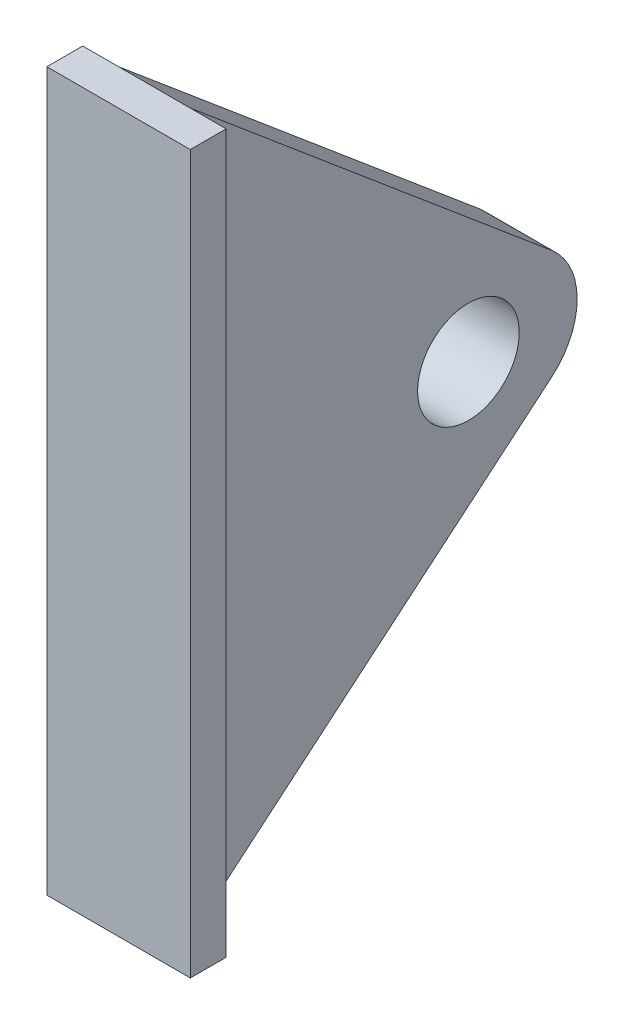
ISO-10303-21;
HEADER;
FILE_DESCRIPTION(('STEP AP214'),'2;1');
FILE_NAME('part.step','',(''),(''),'','','');
FILE_SCHEMA(('AUTOMOTIVE_DESIGN { 1 0 10303 214 1 1 1 1 }'));
ENDSEC;
DATA;
#1=APPLICATION_CONTEXT('core data for automotive mechanical design processes');
#2=APPLICATION_PROTOCOL_DEFINITION('international standard','automotive_design',2000,#1);
#3=PRODUCT_CONTEXT('',#1,'mechanical');
#4=PRODUCT('Part','Part','',(#3));
#5=PRODUCT_RELATED_PRODUCT_CATEGORY('part','',(#4));
#6=PRODUCT_DEFINITION_FORMATION('','',#4);
#7=PRODUCT_DEFINITION_CONTEXT('part definition',#1,'design');
#8=PRODUCT_DEFINITION('design','',#6,#7);
#9=PRODUCT_DEFINITION_SHAPE('','',#8);
#10=(LENGTH_UNIT() NAMED_UNIT(*) SI_UNIT(.MILLI.,.METRE.));
#11=(NAMED_UNIT(*) PLANE_ANGLE_UNIT() SI_UNIT($,.RADIAN.));
#12=(NAMED_UNIT(*) SI_UNIT($,.STERADIAN.) SOLID_ANGLE_UNIT());
#13=UNCERTAINTY_MEASURE_WITH_UNIT(LENGTH_MEASURE(1.E-05),#10,'distance_accuracy_value','');
#14=(GEOMETRIC_REPRESENTATION_CONTEXT(3) GLOBAL_UNCERTAINTY_ASSIGNED_CONTEXT((#13)) GLOBAL_UNIT_ASSIGNED_CONTEXT((#10,
#11,#12)) REPRESENTATION_CONTEXT('',''));
#15=CARTESIAN_POINT('',(0.,0.,0.));
#16=DIRECTION('',(0.,0.,1.));
#17=DIRECTION('',(1.,0.,0.));
#18=AXIS2_PLACEMENT_3D('',#15,#16,#17);
#19=CARTESIAN_POINT('',(-5.99999999999999,-30.,0.));
#20=DIRECTION('',(0.,0.,-1.));
#21=DIRECTION('',(-1.,0.,0.));
#22=AXIS2_PLACEMENT_3D('',#19,#20,#21);
#23=PLANE('',#22);
#24=DIRECTION('',(-1.,0.,0.));
#25=VECTOR('',#24,1.);
#26=CARTESIAN_POINT('',(6.,30.,0.));
#27=LINE('',#26,#25);
#28=CARTESIAN_POINT('',(-3.,30.,0.));
#29=VERTEX_POINT('',#28);
#30=CARTESIAN_POINT('',(-6.,30.,0.));
#31=VERTEX_POINT('',#30);
#32=EDGE_CURVE('E184',#29,#31,#27,.T.);
#33=ORIENTED_EDGE('',*,*,#32,.F.);
#34=DIRECTION('',(0.,-1.,0.));
#35=VECTOR('',#34,1.);
#36=CARTESIAN_POINT('',(-3.,-30.,0.));
#37=LINE('',#36,#35);
#38=CARTESIAN_POINT('',(-3.,-30.,0.));
#39=VERTEX_POINT('',#38);
#40=EDGE_CURVE('E154',#29,#39,#37,.T.);
#41=ORIENTED_EDGE('',*,*,#40,.T.);
#42=DIRECTION('',(1.,0.,0.));
#43=VECTOR('',#42,1.);
#44=CARTESIAN_POINT('',(6.00000000000001,-30.,0.));
#45=LINE('',#44,#43);
#46=CARTESIAN_POINT('',(-5.99999999999999,-30.,0.));
#47=VERTEX_POINT('',#46);
#48=EDGE_CURVE('E122',#47,#39,#45,.T.);
#49=ORIENTED_EDGE('',*,*,#48,.F.);
#50=DIRECTION('',(0.,-1.,0.));
#51=VECTOR('',#50,1.);
#52=CARTESIAN_POINT('',(-6.,30.,0.));
#53=LINE('',#52,#51);
#54=EDGE_CURVE('E123',#31,#47,#53,.T.);
#55=ORIENTED_EDGE('',*,*,#54,.F.);
#56=EDGE_LOOP('',(#33,#41,#49,#55));
#57=FACE_BOUND('',#56,.T.);
#58=ADVANCED_FACE('F31',(#57),#23,.T.);
#59=CARTESIAN_POINT('',(-6.,30.,3.));
#60=DIRECTION('',(1.,0.,0.));
#61=DIRECTION('',(0.,1.,0.));
#62=AXIS2_PLACEMENT_3D('',#59,#60,#61);
#63=PLANE('',#62);
#64=ORIENTED_EDGE('',*,*,#54,.T.);
#65=DIRECTION('',(0.,0.,-1.));
#66=VECTOR('',#65,1.);
#67=CARTESIAN_POINT('',(-5.99999999999999,-30.,3.));
#68=LINE('',#67,#66);
#69=CARTESIAN_POINT('',(-5.99999999999999,-30.,3.));
#70=VERTEX_POINT('',#69);
#71=EDGE_CURVE('E148',#70,#47,#68,.T.);
#72=ORIENTED_EDGE('',*,*,#71,.F.);
#73=DIRECTION('',(0.,-1.,0.));
#74=VECTOR('',#73,1.);
#75=CARTESIAN_POINT('',(-6.,30.,3.));
#76=LINE('',#75,#74);
#77=CARTESIAN_POINT('',(-6.,30.,3.));
#78=VERTEX_POINT('',#77);
#79=EDGE_CURVE('E167',#78,#70,#76,.T.);
#80=ORIENTED_EDGE('',*,*,#79,.F.);
#81=DIRECTION('',(0.,0.,-1.));
#82=VECTOR('',#81,1.);
#83=CARTESIAN_POINT('',(-6.,30.,3.));
#84=LINE('',#83,#82);
#85=EDGE_CURVE('E177',#78,#31,#84,.T.);
#86=ORIENTED_EDGE('',*,*,#85,.T.);
#87=EDGE_LOOP('',(#64,#72,#80,#86));
#88=FACE_BOUND('',#87,.T.);
#89=ADVANCED_FACE('F205',(#88),#63,.F.);
#90=CARTESIAN_POINT('',(6.00000000000001,-30.,3.));
#91=DIRECTION('',(0.,1.,0.));
#92=DIRECTION('',(0.,0.,1.));
#93=AXIS2_PLACEMENT_3D('',#90,#91,#92);
#94=PLANE('',#93);
#95=ORIENTED_EDGE('',*,*,#48,.T.);
#96=DIRECTION('',(1.,0.,0.));
#97=VECTOR('',#96,1.);
#98=CARTESIAN_POINT('',(-3.,-30.,0.));
#99=LINE('',#98,#97);
#100=CARTESIAN_POINT('',(3.,-30.,0.));
#101=VERTEX_POINT('',#100);
#102=EDGE_CURVE('E100',#39,#101,#99,.T.);
#103=ORIENTED_EDGE('',*,*,#102,.T.);
#104=CARTESIAN_POINT('',(6.00000000000001,-30.,0.));
#105=VERTEX_POINT('',#104);
#106=EDGE_CURVE('E116',#101,#105,#45,.T.);
#107=ORIENTED_EDGE('',*,*,#106,.T.);
#108=DIRECTION('',(0.,0.,-1.));
#109=VECTOR('',#108,1.);
#110=CARTESIAN_POINT('',(6.00000000000001,-30.,3.));
#111=LINE('',#110,#109);
#112=CARTESIAN_POINT('',(6.00000000000001,-30.,3.));
#113=VERTEX_POINT('',#112);
#114=EDGE_CURVE('E150',#113,#105,#111,.T.);
#115=ORIENTED_EDGE('',*,*,#114,.F.);
#116=DIRECTION('',(1.,0.,0.));
#117=VECTOR('',#116,1.);
#118=CARTESIAN_POINT('',(6.00000000000001,-30.,3.));
#119=LINE('',#118,#117);
#120=EDGE_CURVE('E170',#70,#113,#119,.T.);
#121=ORIENTED_EDGE('',*,*,#120,.F.);
#122=ORIENTED_EDGE('',*,*,#71,.T.);
#123=EDGE_LOOP('',(#95,#103,#107,#115,#121,#122));
#124=FACE_BOUND('',#123,.T.);
#125=ADVANCED_FACE('F126',(#124),#94,.F.);
#126=CARTESIAN_POINT('',(6.,30.,3.));
#127=DIRECTION('',(-1.,0.,0.));
#128=DIRECTION('',(0.,-1.,0.));
#129=AXIS2_PLACEMENT_3D('',#126,#127,#128);
#130=PLANE('',#129);
#131=DIRECTION('',(0.,1.,0.));
#132=VECTOR('',#131,1.);
#133=CARTESIAN_POINT('',(6.,30.,0.));
#134=LINE('',#133,#132);
#135=CARTESIAN_POINT('',(6.,30.,0.));
#136=VERTEX_POINT('',#135);
#137=EDGE_CURVE('E118',#105,#136,#134,.T.);
#138=ORIENTED_EDGE('',*,*,#137,.T.);
#139=DIRECTION('',(0.,0.,-1.));
#140=VECTOR('',#139,1.);
#141=CARTESIAN_POINT('',(6.,30.,3.));
#142=LINE('',#141,#140);
#143=CARTESIAN_POINT('',(6.,30.,3.));
#144=VERTEX_POINT('',#143);
#145=EDGE_CURVE('E191',#144,#136,#142,.T.);
#146=ORIENTED_EDGE('',*,*,#145,.F.);
#147=DIRECTION('',(0.,1.,0.));
#148=VECTOR('',#147,1.);
#149=CARTESIAN_POINT('',(6.,30.,3.));
#150=LINE('',#149,#148);
#151=EDGE_CURVE('E173',#113,#144,#150,.T.);
#152=ORIENTED_EDGE('',*,*,#151,.F.);
#153=ORIENTED_EDGE('',*,*,#114,.T.);
#154=EDGE_LOOP('',(#138,#146,#152,#153));
#155=FACE_BOUND('',#154,.T.);
#156=ADVANCED_FACE('F196',(#155),#130,.F.);
#157=CARTESIAN_POINT('',(6.,30.,3.));
#158=DIRECTION('',(0.,-1.,0.));
#159=DIRECTION('',(0.,0.,-1.));
#160=AXIS2_PLACEMENT_3D('',#157,#158,#159);
#161=PLANE('',#160);
#162=CARTESIAN_POINT('',(3.,30.,0.));
#163=VERTEX_POINT('',#162);
#164=EDGE_CURVE('E171',#136,#163,#27,.T.);
#165=ORIENTED_EDGE('',*,*,#164,.T.);
#166=DIRECTION('',(1.,0.,0.));
#167=VECTOR('',#166,1.);
#168=CARTESIAN_POINT('',(-3.,30.,0.));
#169=LINE('',#168,#167);
#170=EDGE_CURVE('E128',#29,#163,#169,.T.);
#171=ORIENTED_EDGE('',*,*,#170,.F.);
#172=ORIENTED_EDGE('',*,*,#32,.T.);
#173=ORIENTED_EDGE('',*,*,#85,.F.);
#174=DIRECTION('',(-1.,0.,0.));
#175=VECTOR('',#174,1.);
#176=CARTESIAN_POINT('',(6.,30.,3.));
#177=LINE('',#176,#175);
#178=EDGE_CURVE('E175',#144,#78,#177,.T.);
#179=ORIENTED_EDGE('',*,*,#178,.F.);
#180=ORIENTED_EDGE('',*,*,#145,.T.);
#181=EDGE_LOOP('',(#165,#171,#172,#173,#179,#180));
#182=FACE_BOUND('',#181,.T.);
#183=ADVANCED_FACE('F209',(#182),#161,.F.);
#184=CARTESIAN_POINT('',(-5.99999999999999,-30.,3.));
#185=DIRECTION('',(0.,0.,-1.));
#186=DIRECTION('',(-1.,0.,0.));
#187=AXIS2_PLACEMENT_3D('',#184,#185,#186);
#188=PLANE('',#187);
#189=ORIENTED_EDGE('',*,*,#79,.T.);
#190=ORIENTED_EDGE('',*,*,#120,.T.);
#191=ORIENTED_EDGE('',*,*,#151,.T.);
#192=ORIENTED_EDGE('',*,*,#178,.T.);
#193=EDGE_LOOP('',(#189,#190,#191,#192));
#194=FACE_BOUND('',#193,.T.);
#195=ADVANCED_FACE('F201',(#194),#188,.F.);
#196=DIRECTION('',(0.,-1.,0.));
#197=VECTOR('',#196,1.);
#198=CARTESIAN_POINT('',(3.,-30.,0.));
#199=LINE('',#198,#197);
#200=EDGE_CURVE('E105',#163,#101,#199,.T.);
#201=ORIENTED_EDGE('',*,*,#200,.F.);
#202=ORIENTED_EDGE('',*,*,#164,.F.);
#203=ORIENTED_EDGE('',*,*,#137,.F.);
#204=ORIENTED_EDGE('',*,*,#106,.F.);
#205=EDGE_LOOP('',(#201,#202,#203,#204));
#206=FACE_BOUND('',#205,.T.);
#207=ADVANCED_FACE('F117',(#206),#23,.T.);
#208=CARTESIAN_POINT('',(-3.,30.,0.));
#209=DIRECTION('',(0.,0.765348251507662,-0.643616387232461));
#210=DIRECTION('',(0.,0.643616387232461,0.765348251507662));
#211=AXIS2_PLACEMENT_3D('',#208,#209,#210);
#212=PLANE('',#211);
#213=DIRECTION('',(0.,0.643616387232461,0.765348251507662));
#214=VECTOR('',#213,1.);
#215=CARTESIAN_POINT('',(3.,30.,0.));
#216=LINE('',#215,#214);
#217=CARTESIAN_POINT('',(3.,4.59208950904598,-30.213494022941));
#218=VERTEX_POINT('',#217);
#219=EDGE_CURVE('E104',#218,#163,#216,.T.);
#220=ORIENTED_EDGE('',*,*,#219,.F.);
#221=DIRECTION('',(1.,0.,0.));
#222=VECTOR('',#221,1.);
#223=CARTESIAN_POINT('',(-3.,4.59208950904597,-30.213494022941));
#224=LINE('',#223,#222);
#225=CARTESIAN_POINT('',(-3.,4.59208950904598,-30.213494022941));
#226=VERTEX_POINT('',#225);
#227=EDGE_CURVE('E40',#218,#226,#224,.F.);
#228=ORIENTED_EDGE('',*,*,#227,.T.);
#229=DIRECTION('',(0.,0.643616387232461,0.765348251507662));
#230=VECTOR('',#229,1.);
#231=CARTESIAN_POINT('',(-3.,30.,0.));
#232=LINE('',#231,#230);
#233=EDGE_CURVE('E129',#226,#29,#232,.T.);
#234=ORIENTED_EDGE('',*,*,#233,.T.);
#235=ORIENTED_EDGE('',*,*,#170,.T.);
#236=EDGE_LOOP('',(#220,#228,#234,#235));
#237=FACE_BOUND('',#236,.T.);
#238=ADVANCED_FACE('F210',(#237),#212,.T.);
#239=CARTESIAN_POINT('',(-3.,0.,-35.6741189328));
#240=DIRECTION('',(0.,-0.765348251507662,-0.64361638723246));
#241=DIRECTION('',(0.,0.64361638723246,-0.765348251507662));
#242=AXIS2_PLACEMENT_3D('',#239,#240,#241);
#243=PLANE('',#242);
#244=DIRECTION('',(0.,0.64361638723246,-0.765348251507662));
#245=VECTOR('',#244,1.);
#246=CARTESIAN_POINT('',(-3.,0.,-35.6741189328));
#247=LINE('',#246,#245);
#248=CARTESIAN_POINT('',(-3.,-4.59208950904597,-30.213494022941));
#249=VERTEX_POINT('',#248);
#250=EDGE_CURVE('E132',#39,#249,#247,.T.);
#251=ORIENTED_EDGE('',*,*,#250,.T.);
#252=DIRECTION('',(1.,0.,0.));
#253=VECTOR('',#252,1.);
#254=CARTESIAN_POINT('',(-3.,-4.59208950904597,-30.213494022941));
#255=LINE('',#254,#253);
#256=CARTESIAN_POINT('',(3.,-4.59208950904597,-30.213494022941));
#257=VERTEX_POINT('',#256);
#258=EDGE_CURVE('E103',#249,#257,#255,.T.);
#259=ORIENTED_EDGE('',*,*,#258,.T.);
#260=DIRECTION('',(0.,0.64361638723246,-0.765348251507662));
#261=VECTOR('',#260,1.);
#262=CARTESIAN_POINT('',(3.,0.,-35.6741189328));
#263=LINE('',#262,#261);
#264=EDGE_CURVE('E95',#101,#257,#263,.T.);
#265=ORIENTED_EDGE('',*,*,#264,.F.);
#266=ORIENTED_EDGE('',*,*,#102,.F.);
#267=EDGE_LOOP('',(#251,#259,#265,#266));
#268=FACE_BOUND('',#267,.T.);
#269=ADVANCED_FACE('F98',(#268),#243,.T.);
#270=CARTESIAN_POINT('',(-3.,30.,0.));
#271=DIRECTION('',(-1.,0.,0.));
#272=DIRECTION('',(0.,0.,1.));
#273=AXIS2_PLACEMENT_3D('',#270,#271,#272);
#274=PLANE('',#273);
#275=CARTESIAN_POINT('',(-3.,0.,-23.2571546846995));
#276=DIRECTION('',(-1.,0.,0.));
#277=DIRECTION('',(0.,0.,1.));
#278=AXIS2_PLACEMENT_3D('',#275,#276,#277);
#279=CIRCLE('',#278,4.25);
#280=CARTESIAN_POINT('',(-3.,0.,-19.0071546846995));
#281=VERTEX_POINT('',#280);
#282=EDGE_CURVE('E250',#281,#281,#279,.T.);
#283=ORIENTED_EDGE('',*,*,#282,.F.);
#284=EDGE_LOOP('',(#283));
#285=FACE_BOUND('',#284,.T.);
#286=ORIENTED_EDGE('',*,*,#233,.F.);
#287=CARTESIAN_POINT('',(-3.,0.,-26.3517956995463));
#288=DIRECTION('',(-1.,0.,0.));
#289=DIRECTION('',(0.,0.,1.));
#290=AXIS2_PLACEMENT_3D('',#287,#288,#289);
#291=CIRCLE('',#290,6.);
#292=EDGE_CURVE('E11',#226,#249,#291,.T.);
#293=ORIENTED_EDGE('',*,*,#292,.T.);
#294=ORIENTED_EDGE('',*,*,#250,.F.);
#295=ORIENTED_EDGE('',*,*,#40,.F.);
#296=EDGE_LOOP('',(#286,#293,#294,#295));
#297=FACE_BOUND('',#296,.T.);
#298=ADVANCED_FACE('F213',(#285,#297),#274,.T.);
#299=CARTESIAN_POINT('',(3.,30.,0.));
#300=DIRECTION('',(-1.,0.,0.));
#301=DIRECTION('',(0.,0.,1.));
#302=AXIS2_PLACEMENT_3D('',#299,#300,#301);
#303=PLANE('',#302);
#304=CARTESIAN_POINT('',(3.,0.,-23.2571546846995));
#305=DIRECTION('',(-1.,0.,0.));
#306=DIRECTION('',(0.,0.,1.));
#307=AXIS2_PLACEMENT_3D('',#304,#305,#306);
#308=CIRCLE('',#307,4.25);
#309=CARTESIAN_POINT('',(3.,0.,-19.0071546846995));
#310=VERTEX_POINT('',#309);
#311=EDGE_CURVE('E35',#310,#310,#308,.T.);
#312=ORIENTED_EDGE('',*,*,#311,.T.);
#313=EDGE_LOOP('',(#312));
#314=FACE_BOUND('',#313,.T.);
#315=ORIENTED_EDGE('',*,*,#264,.T.);
#316=CARTESIAN_POINT('',(3.,0.,-26.3517956995463));
#317=DIRECTION('',(-1.,0.,0.));
#318=DIRECTION('',(0.,0.,1.));
#319=AXIS2_PLACEMENT_3D('',#316,#317,#318);
#320=CIRCLE('',#319,6.);
#321=EDGE_CURVE('E54',#257,#218,#320,.F.);
#322=ORIENTED_EDGE('',*,*,#321,.T.);
#323=ORIENTED_EDGE('',*,*,#219,.T.);
#324=ORIENTED_EDGE('',*,*,#200,.T.);
#325=EDGE_LOOP('',(#315,#322,#323,#324));
#326=FACE_BOUND('',#325,.T.);
#327=ADVANCED_FACE('F109',(#314,#326),#303,.F.);
#328=CARTESIAN_POINT('',(-3.,0.,-26.3517956995463));
#329=DIRECTION('',(1.,0.,0.));
#330=DIRECTION('',(0.,0.,-1.));
#331=AXIS2_PLACEMENT_3D('',#328,#329,#330);
#332=CYLINDRICAL_SURFACE('',#331,6.);
#333=ORIENTED_EDGE('',*,*,#292,.F.);
#334=ORIENTED_EDGE('',*,*,#227,.F.);
#335=ORIENTED_EDGE('',*,*,#321,.F.);
#336=ORIENTED_EDGE('',*,*,#258,.F.);
#337=EDGE_LOOP('',(#333,#334,#335,#336));
#338=FACE_BOUND('',#337,.T.);
#339=ADVANCED_FACE('F33',(#338),#332,.T.);
#340=CARTESIAN_POINT('',(6.00002500000001,0.,-23.2571546846995));
#341=DIRECTION('',(-1.,0.,0.));
#342=DIRECTION('',(0.,0.,1.));
#343=AXIS2_PLACEMENT_3D('',#340,#341,#342);
#344=CYLINDRICAL_SURFACE('',#343,4.25);
#345=ORIENTED_EDGE('',*,*,#282,.T.);
#346=EDGE_LOOP('',(#345));
#347=FACE_BOUND('',#346,.T.);
#348=ORIENTED_EDGE('',*,*,#311,.F.);
#349=EDGE_LOOP('',(#348));
#350=FACE_BOUND('',#349,.T.);
#351=ADVANCED_FACE('F216',(#347,#350),#344,.F.);
#352=CLOSED_SHELL('',(#58,#89,#125,#156,#183,#195,#207,#238,#269,#298,#327,#339,#351));
#353=MANIFOLD_SOLID_BREP('B2',#352);
#354=ADVANCED_BREP_SHAPE_REPRESENTATION('',(#18,#353),#14);
#355=SHAPE_DEFINITION_REPRESENTATION(#9,#354);
ENDSEC;
END-ISO-10303-21;
